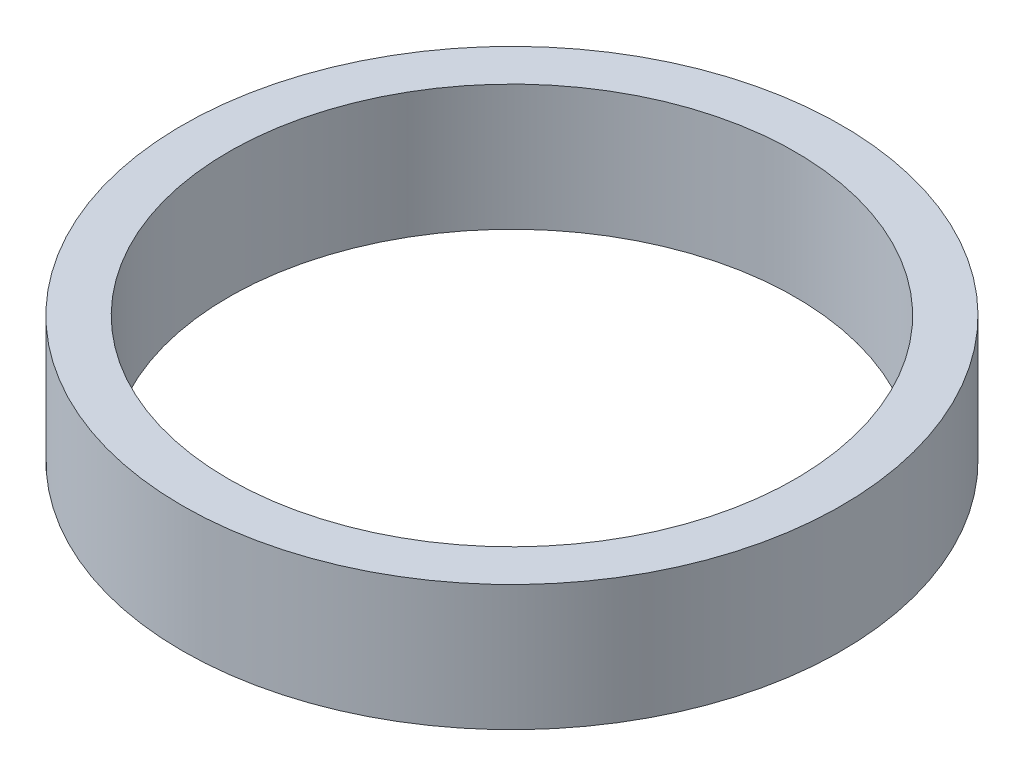
ISO-10303-21;
HEADER;
FILE_DESCRIPTION(('STEP AP214'),'2;1');
FILE_NAME('part.step','',(''),(''),'','','');
FILE_SCHEMA(('AUTOMOTIVE_DESIGN { 1 0 10303 214 1 1 1 1 }'));
ENDSEC;
DATA;
#1=APPLICATION_CONTEXT('core data for automotive mechanical design processes');
#2=APPLICATION_PROTOCOL_DEFINITION('international standard','automotive_design',2000,#1);
#3=PRODUCT_CONTEXT('',#1,'mechanical');
#4=PRODUCT('Part','Part','',(#3));
#5=PRODUCT_RELATED_PRODUCT_CATEGORY('part','',(#4));
#6=PRODUCT_DEFINITION_FORMATION('','',#4);
#7=PRODUCT_DEFINITION_CONTEXT('part definition',#1,'design');
#8=PRODUCT_DEFINITION('design','',#6,#7);
#9=PRODUCT_DEFINITION_SHAPE('','',#8);
#10=(LENGTH_UNIT() NAMED_UNIT(*) SI_UNIT(.MILLI.,.METRE.));
#11=(NAMED_UNIT(*) PLANE_ANGLE_UNIT() SI_UNIT($,.RADIAN.));
#12=(NAMED_UNIT(*) SI_UNIT($,.STERADIAN.) SOLID_ANGLE_UNIT());
#13=UNCERTAINTY_MEASURE_WITH_UNIT(LENGTH_MEASURE(1.E-05),#10,'distance_accuracy_value','');
#14=(GEOMETRIC_REPRESENTATION_CONTEXT(3) GLOBAL_UNCERTAINTY_ASSIGNED_CONTEXT((#13)) GLOBAL_UNIT_ASSIGNED_CONTEXT((#10,
#11,#12)) REPRESENTATION_CONTEXT('',''));
#15=CARTESIAN_POINT('',(0.,0.,0.));
#16=DIRECTION('',(0.,0.,1.));
#17=DIRECTION('',(1.,0.,0.));
#18=AXIS2_PLACEMENT_3D('',#15,#16,#17);
#19=CARTESIAN_POINT('',(0.,4.,0.));
#20=DIRECTION('',(0.,1.,0.));
#21=DIRECTION('',(0.,0.,1.));
#22=AXIS2_PLACEMENT_3D('',#19,#20,#21);
#23=PLANE('',#22);
#24=CARTESIAN_POINT('',(0.,4.,0.));
#25=DIRECTION('',(0.,1.,0.));
#26=DIRECTION('',(0.,0.,1.));
#27=AXIS2_PLACEMENT_3D('',#24,#25,#26);
#28=CIRCLE('',#27,10.485);
#29=CARTESIAN_POINT('',(0.,4.,10.485));
#30=VERTEX_POINT('',#29);
#31=EDGE_CURVE('E10',#30,#30,#28,.T.);
#32=ORIENTED_EDGE('',*,*,#31,.T.);
#33=EDGE_LOOP('',(#32));
#34=FACE_BOUND('',#33,.T.);
#35=CARTESIAN_POINT('',(0.,4.,0.));
#36=DIRECTION('',(0.,1.,0.));
#37=DIRECTION('',(0.,0.,1.));
#38=AXIS2_PLACEMENT_3D('',#35,#36,#37);
#39=CIRCLE('',#38,9.015);
#40=CARTESIAN_POINT('',(0.,4.,9.015));
#41=VERTEX_POINT('',#40);
#42=EDGE_CURVE('E42',#41,#41,#39,.T.);
#43=ORIENTED_EDGE('',*,*,#42,.F.);
#44=EDGE_LOOP('',(#43));
#45=FACE_BOUND('',#44,.T.);
#46=ADVANCED_FACE('F31',(#34,#45),#23,.T.);
#47=CARTESIAN_POINT('',(0.,0.,0.));
#48=DIRECTION('',(0.,1.,0.));
#49=DIRECTION('',(0.,0.,1.));
#50=AXIS2_PLACEMENT_3D('',#47,#48,#49);
#51=PLANE('',#50);
#52=CARTESIAN_POINT('',(0.,0.,0.));
#53=DIRECTION('',(0.,1.,0.));
#54=DIRECTION('',(0.,0.,1.));
#55=AXIS2_PLACEMENT_3D('',#52,#53,#54);
#56=CIRCLE('',#55,10.485);
#57=CARTESIAN_POINT('',(0.,0.,10.485));
#58=VERTEX_POINT('',#57);
#59=EDGE_CURVE('E35',#58,#58,#56,.T.);
#60=ORIENTED_EDGE('',*,*,#59,.F.);
#61=EDGE_LOOP('',(#60));
#62=FACE_BOUND('',#61,.T.);
#63=CARTESIAN_POINT('',(0.,0.,0.));
#64=DIRECTION('',(0.,1.,0.));
#65=DIRECTION('',(0.,0.,1.));
#66=AXIS2_PLACEMENT_3D('',#63,#64,#65);
#67=CIRCLE('',#66,9.015);
#68=CARTESIAN_POINT('',(0.,0.,9.015));
#69=VERTEX_POINT('',#68);
#70=EDGE_CURVE('E44',#69,#69,#67,.T.);
#71=ORIENTED_EDGE('',*,*,#70,.T.);
#72=EDGE_LOOP('',(#71));
#73=FACE_BOUND('',#72,.T.);
#74=ADVANCED_FACE('F54',(#62,#73),#51,.F.);
#75=CARTESIAN_POINT('',(0.,4.,0.));
#76=DIRECTION('',(0.,-1.,0.));
#77=DIRECTION('',(0.,0.,-1.));
#78=AXIS2_PLACEMENT_3D('',#75,#76,#77);
#79=CYLINDRICAL_SURFACE('',#78,10.485);
#80=ORIENTED_EDGE('',*,*,#31,.F.);
#81=EDGE_LOOP('',(#80));
#82=FACE_BOUND('',#81,.T.);
#83=ORIENTED_EDGE('',*,*,#59,.T.);
#84=EDGE_LOOP('',(#83));
#85=FACE_BOUND('',#84,.T.);
#86=ADVANCED_FACE('F33',(#82,#85),#79,.T.);
#87=CARTESIAN_POINT('',(0.,4.,0.));
#88=DIRECTION('',(0.,-1.,0.));
#89=DIRECTION('',(0.,0.,-1.));
#90=AXIS2_PLACEMENT_3D('',#87,#88,#89);
#91=CYLINDRICAL_SURFACE('',#90,9.015);
#92=ORIENTED_EDGE('',*,*,#42,.T.);
#93=EDGE_LOOP('',(#92));
#94=FACE_BOUND('',#93,.T.);
#95=ORIENTED_EDGE('',*,*,#70,.F.);
#96=EDGE_LOOP('',(#95));
#97=FACE_BOUND('',#96,.T.);
#98=ADVANCED_FACE('F50',(#94,#97),#91,.F.);
#99=CLOSED_SHELL('',(#46,#74,#86,#98));
#100=MANIFOLD_SOLID_BREP('B2',#99);
#101=ADVANCED_BREP_SHAPE_REPRESENTATION('',(#18,#100),#14);
#102=SHAPE_DEFINITION_REPRESENTATION(#9,#101);
ENDSEC;
END-ISO-10303-21;
